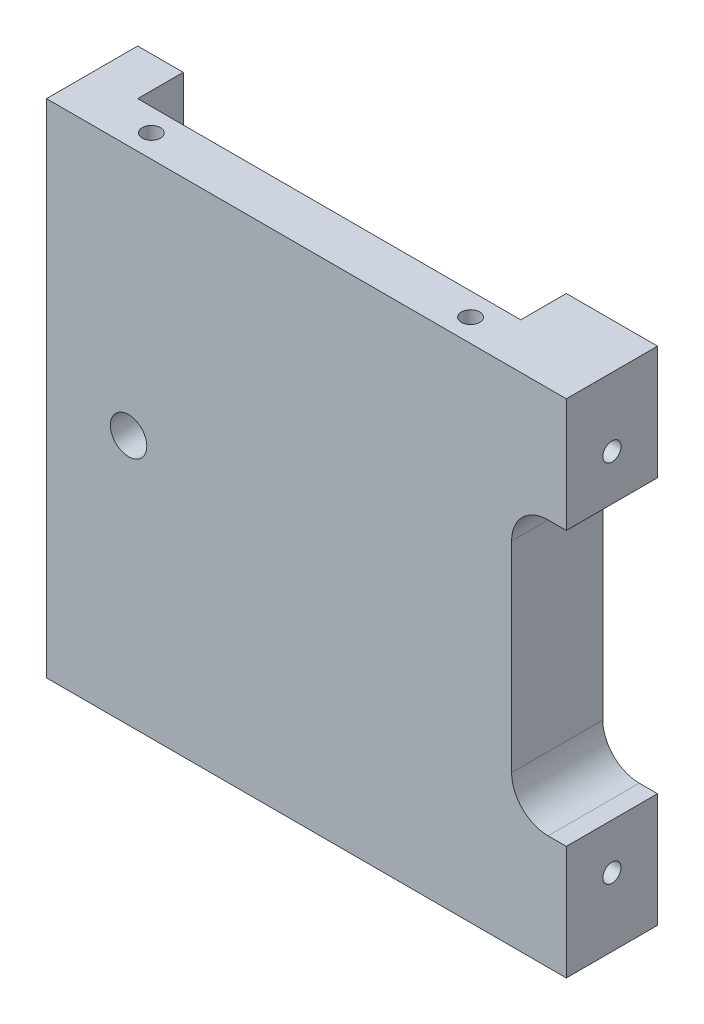
ISO-10303-21;
HEADER;
FILE_DESCRIPTION(('STEP AP214'),'2;1');
FILE_NAME('part.step','',(''),(''),'','','');
FILE_SCHEMA(('AUTOMOTIVE_DESIGN { 1 0 10303 214 1 1 1 1 }'));
ENDSEC;
DATA;
#1=APPLICATION_CONTEXT('core data for automotive mechanical design processes');
#2=APPLICATION_PROTOCOL_DEFINITION('international standard','automotive_design',2000,#1);
#3=PRODUCT_CONTEXT('',#1,'mechanical');
#4=PRODUCT('Part','Part','',(#3));
#5=PRODUCT_RELATED_PRODUCT_CATEGORY('part','',(#4));
#6=PRODUCT_DEFINITION_FORMATION('','',#4);
#7=PRODUCT_DEFINITION_CONTEXT('part definition',#1,'design');
#8=PRODUCT_DEFINITION('design','',#6,#7);
#9=PRODUCT_DEFINITION_SHAPE('','',#8);
#10=(LENGTH_UNIT() NAMED_UNIT(*) SI_UNIT(.MILLI.,.METRE.));
#11=(NAMED_UNIT(*) PLANE_ANGLE_UNIT() SI_UNIT($,.RADIAN.));
#12=(NAMED_UNIT(*) SI_UNIT($,.STERADIAN.) SOLID_ANGLE_UNIT());
#13=UNCERTAINTY_MEASURE_WITH_UNIT(LENGTH_MEASURE(1.E-05),#10,'distance_accuracy_value','');
#14=(GEOMETRIC_REPRESENTATION_CONTEXT(3) GLOBAL_UNCERTAINTY_ASSIGNED_CONTEXT((#13)) GLOBAL_UNIT_ASSIGNED_CONTEXT((#10,
#11,#12)) REPRESENTATION_CONTEXT('',''));
#15=CARTESIAN_POINT('',(0.,0.,0.));
#16=DIRECTION('',(0.,0.,1.));
#17=DIRECTION('',(1.,0.,0.));
#18=AXIS2_PLACEMENT_3D('',#15,#16,#17);
#19=CARTESIAN_POINT('',(85.,-27.5,10.));
#20=DIRECTION('',(-1.,0.,0.));
#21=DIRECTION('',(0.,0.,1.));
#22=AXIS2_PLACEMENT_3D('',#19,#20,#21);
#23=PLANE('',#22);
#24=CARTESIAN_POINT('',(85.,-20.,5.));
#25=DIRECTION('',(1.,0.,0.));
#26=DIRECTION('',(0.,0.,-1.));
#27=AXIS2_PLACEMENT_3D('',#24,#25,#26);
#28=CIRCLE('',#27,0.999999999999997);
#29=CARTESIAN_POINT('',(85.,-20.,4.));
#30=VERTEX_POINT('',#29);
#31=EDGE_CURVE('E305',#30,#30,#28,.T.);
#32=ORIENTED_EDGE('',*,*,#31,.F.);
#33=EDGE_LOOP('',(#32));
#34=FACE_BOUND('',#33,.T.);
#35=DIRECTION('',(0.,1.,0.));
#36=VECTOR('',#35,1.);
#37=CARTESIAN_POINT('',(85.,-27.5,0.));
#38=LINE('',#37,#36);
#39=CARTESIAN_POINT('',(85.,-27.5,0.));
#40=VERTEX_POINT('',#39);
#41=CARTESIAN_POINT('',(85.,-15.,0.));
#42=VERTEX_POINT('',#41);
#43=EDGE_CURVE('E205',#40,#42,#38,.T.);
#44=ORIENTED_EDGE('',*,*,#43,.T.);
#45=DIRECTION('',(0.,0.,1.));
#46=VECTOR('',#45,1.);
#47=CARTESIAN_POINT('',(85.,-15.,0.));
#48=LINE('',#47,#46);
#49=CARTESIAN_POINT('',(85.,-15.,10.));
#50=VERTEX_POINT('',#49);
#51=EDGE_CURVE('E197',#42,#50,#48,.T.);
#52=ORIENTED_EDGE('',*,*,#51,.T.);
#53=DIRECTION('',(0.,1.,0.));
#54=VECTOR('',#53,1.);
#55=CARTESIAN_POINT('',(85.,-27.5,10.));
#56=LINE('',#55,#54);
#57=CARTESIAN_POINT('',(85.,-27.5,10.));
#58=VERTEX_POINT('',#57);
#59=EDGE_CURVE('E368',#58,#50,#56,.T.);
#60=ORIENTED_EDGE('',*,*,#59,.F.);
#61=DIRECTION('',(0.,0.,-1.));
#62=VECTOR('',#61,1.);
#63=CARTESIAN_POINT('',(85.,-27.5,10.));
#64=LINE('',#63,#62);
#65=EDGE_CURVE('E218',#58,#40,#64,.T.);
#66=ORIENTED_EDGE('',*,*,#65,.T.);
#67=EDGE_LOOP('',(#44,#52,#60,#66));
#68=FACE_BOUND('',#67,.T.);
#69=ADVANCED_FACE('F36',(#34,#68),#23,.F.);
#70=CARTESIAN_POINT('',(0.,27.5,10.));
#71=DIRECTION('',(0.,-1.,0.));
#72=DIRECTION('',(0.,0.,-1.));
#73=AXIS2_PLACEMENT_3D('',#70,#71,#72);
#74=PLANE('',#73);
#75=DIRECTION('',(-1.,0.,0.));
#76=VECTOR('',#75,1.);
#77=CARTESIAN_POINT('',(0.,27.5,0.));
#78=LINE('',#77,#76);
#79=CARTESIAN_POINT('',(33.,27.5,0.));
#80=VERTEX_POINT('',#79);
#81=CARTESIAN_POINT('',(28.,27.5,0.));
#82=VERTEX_POINT('',#81);
#83=EDGE_CURVE('E209',#80,#82,#78,.T.);
#84=ORIENTED_EDGE('',*,*,#83,.T.);
#85=DIRECTION('',(0.,0.,1.));
#86=VECTOR('',#85,1.);
#87=CARTESIAN_POINT('',(28.,27.5,10.));
#88=LINE('',#87,#86);
#89=CARTESIAN_POINT('',(28.,27.5,10.));
#90=VERTEX_POINT('',#89);
#91=EDGE_CURVE('E287',#82,#90,#88,.T.);
#92=ORIENTED_EDGE('',*,*,#91,.T.);
#93=DIRECTION('',(-1.,0.,0.));
#94=VECTOR('',#93,1.);
#95=CARTESIAN_POINT('',(0.,27.5,10.));
#96=LINE('',#95,#94);
#97=CARTESIAN_POINT('',(85.,27.5,10.));
#98=VERTEX_POINT('',#97);
#99=EDGE_CURVE('E219',#98,#90,#96,.T.);
#100=ORIENTED_EDGE('',*,*,#99,.F.);
#101=DIRECTION('',(0.,0.,-1.));
#102=VECTOR('',#101,1.);
#103=CARTESIAN_POINT('',(85.,27.5,10.));
#104=LINE('',#103,#102);
#105=CARTESIAN_POINT('',(85.,27.5,0.));
#106=VERTEX_POINT('',#105);
#107=EDGE_CURVE('E216',#98,#106,#104,.T.);
#108=ORIENTED_EDGE('',*,*,#107,.T.);
#109=CARTESIAN_POINT('',(75.,27.5,0.));
#110=VERTEX_POINT('',#109);
#111=EDGE_CURVE('E204',#106,#110,#78,.T.);
#112=ORIENTED_EDGE('',*,*,#111,.T.);
#113=DIRECTION('',(0.,0.,-1.));
#114=VECTOR('',#113,1.);
#115=CARTESIAN_POINT('',(75.,27.5,0.));
#116=LINE('',#115,#114);
#117=CARTESIAN_POINT('',(75.,27.5,5.));
#118=VERTEX_POINT('',#117);
#119=EDGE_CURVE('E344',#118,#110,#116,.T.);
#120=ORIENTED_EDGE('',*,*,#119,.F.);
#121=DIRECTION('',(1.,0.,0.));
#122=VECTOR('',#121,1.);
#123=CARTESIAN_POINT('',(33.,27.5,5.));
#124=LINE('',#123,#122);
#125=CARTESIAN_POINT('',(33.,27.5,5.));
#126=VERTEX_POINT('',#125);
#127=EDGE_CURVE('E353',#126,#118,#124,.T.);
#128=ORIENTED_EDGE('',*,*,#127,.F.);
#129=DIRECTION('',(0.,0.,1.));
#130=VECTOR('',#129,1.);
#131=CARTESIAN_POINT('',(33.,27.5,0.));
#132=LINE('',#131,#130);
#133=EDGE_CURVE('E226',#80,#126,#132,.T.);
#134=ORIENTED_EDGE('',*,*,#133,.F.);
#135=EDGE_LOOP('',(#84,#92,#100,#108,#112,#120,#128,#134));
#136=FACE_BOUND('',#135,.T.);
#137=CARTESIAN_POINT('',(72.,27.5,7.50000000000001));
#138=DIRECTION('',(0.,1.,0.));
#139=DIRECTION('',(0.,0.,1.));
#140=AXIS2_PLACEMENT_3D('',#137,#138,#139);
#141=CIRCLE('',#140,1.);
#142=CARTESIAN_POINT('',(72.,27.5,8.50000000000001));
#143=VERTEX_POINT('',#142);
#144=EDGE_CURVE('E320',#143,#143,#141,.T.);
#145=ORIENTED_EDGE('',*,*,#144,.F.);
#146=EDGE_LOOP('',(#145));
#147=FACE_BOUND('',#146,.T.);
#148=CARTESIAN_POINT('',(37.,27.5,7.5));
#149=DIRECTION('',(0.,1.,0.));
#150=DIRECTION('',(0.,0.,1.));
#151=AXIS2_PLACEMENT_3D('',#148,#149,#150);
#152=CIRCLE('',#151,1.);
#153=CARTESIAN_POINT('',(37.,27.5,8.5));
#154=VERTEX_POINT('',#153);
#155=EDGE_CURVE('E314',#154,#154,#152,.T.);
#156=ORIENTED_EDGE('',*,*,#155,.F.);
#157=EDGE_LOOP('',(#156));
#158=FACE_BOUND('',#157,.T.);
#159=ADVANCED_FACE('F374',(#136,#147,#158),#74,.F.);
#160=CARTESIAN_POINT('',(0.,0.,0.));
#161=DIRECTION('',(0.,0.,-1.));
#162=DIRECTION('',(-1.,0.,0.));
#163=AXIS2_PLACEMENT_3D('',#160,#161,#162);
#164=PLANE('',#163);
#165=DIRECTION('',(0.,-1.,0.));
#166=VECTOR('',#165,1.);
#167=CARTESIAN_POINT('',(28.,27.5,0.));
#168=LINE('',#167,#166);
#169=CARTESIAN_POINT('',(28.,-27.5,0.));
#170=VERTEX_POINT('',#169);
#171=EDGE_CURVE('E290',#82,#170,#168,.T.);
#172=ORIENTED_EDGE('',*,*,#171,.F.);
#173=ORIENTED_EDGE('',*,*,#83,.F.);
#174=DIRECTION('',(0.,1.,0.));
#175=VECTOR('',#174,1.);
#176=CARTESIAN_POINT('',(33.,-27.5,0.));
#177=LINE('',#176,#175);
#178=CARTESIAN_POINT('',(33.,-27.5,0.));
#179=VERTEX_POINT('',#178);
#180=EDGE_CURVE('E357',#179,#80,#177,.T.);
#181=ORIENTED_EDGE('',*,*,#180,.F.);
#182=DIRECTION('',(1.,0.,0.));
#183=VECTOR('',#182,1.);
#184=CARTESIAN_POINT('',(0.,-27.5,0.));
#185=LINE('',#184,#183);
#186=EDGE_CURVE('E206',#170,#179,#185,.T.);
#187=ORIENTED_EDGE('',*,*,#186,.F.);
#188=EDGE_LOOP('',(#172,#173,#181,#187));
#189=FACE_BOUND('',#188,.T.);
#190=ADVANCED_FACE('F384',(#189),#164,.T.);
#191=CARTESIAN_POINT('',(0.,-27.5,10.));
#192=DIRECTION('',(0.,1.,0.));
#193=DIRECTION('',(0.,0.,1.));
#194=AXIS2_PLACEMENT_3D('',#191,#192,#193);
#195=PLANE('',#194);
#196=CARTESIAN_POINT('',(37.,-27.5,7.5));
#197=DIRECTION('',(0.,-1.,0.));
#198=DIRECTION('',(0.,0.,-1.));
#199=AXIS2_PLACEMENT_3D('',#196,#197,#198);
#200=CIRCLE('',#199,1.);
#201=CARTESIAN_POINT('',(37.,-27.5,6.5));
#202=VERTEX_POINT('',#201);
#203=EDGE_CURVE('E326',#202,#202,#200,.T.);
#204=ORIENTED_EDGE('',*,*,#203,.F.);
#205=EDGE_LOOP('',(#204));
#206=FACE_BOUND('',#205,.T.);
#207=CARTESIAN_POINT('',(72.,-27.5,7.50000000000001));
#208=DIRECTION('',(0.,-1.,0.));
#209=DIRECTION('',(0.,0.,-1.));
#210=AXIS2_PLACEMENT_3D('',#207,#208,#209);
#211=CIRCLE('',#210,1.);
#212=CARTESIAN_POINT('',(72.,-27.5,6.50000000000001));
#213=VERTEX_POINT('',#212);
#214=EDGE_CURVE('E332',#213,#213,#211,.T.);
#215=ORIENTED_EDGE('',*,*,#214,.F.);
#216=EDGE_LOOP('',(#215));
#217=FACE_BOUND('',#216,.T.);
#218=DIRECTION('',(1.,0.,0.));
#219=VECTOR('',#218,1.);
#220=CARTESIAN_POINT('',(0.,-27.5,10.));
#221=LINE('',#220,#219);
#222=CARTESIAN_POINT('',(28.,-27.5,10.));
#223=VERTEX_POINT('',#222);
#224=EDGE_CURVE('E215',#223,#58,#221,.T.);
#225=ORIENTED_EDGE('',*,*,#224,.F.);
#226=DIRECTION('',(0.,0.,1.));
#227=VECTOR('',#226,1.);
#228=CARTESIAN_POINT('',(28.,-27.5,10.));
#229=LINE('',#228,#227);
#230=EDGE_CURVE('E285',#170,#223,#229,.T.);
#231=ORIENTED_EDGE('',*,*,#230,.F.);
#232=ORIENTED_EDGE('',*,*,#186,.T.);
#233=DIRECTION('',(0.,0.,1.));
#234=VECTOR('',#233,1.);
#235=CARTESIAN_POINT('',(33.,-27.5,0.));
#236=LINE('',#235,#234);
#237=CARTESIAN_POINT('',(33.,-27.5,5.));
#238=VERTEX_POINT('',#237);
#239=EDGE_CURVE('E340',#179,#238,#236,.T.);
#240=ORIENTED_EDGE('',*,*,#239,.T.);
#241=DIRECTION('',(1.,0.,0.));
#242=VECTOR('',#241,1.);
#243=CARTESIAN_POINT('',(33.,-27.5,5.));
#244=LINE('',#243,#242);
#245=CARTESIAN_POINT('',(75.,-27.5,5.));
#246=VERTEX_POINT('',#245);
#247=EDGE_CURVE('E343',#238,#246,#244,.T.);
#248=ORIENTED_EDGE('',*,*,#247,.T.);
#249=DIRECTION('',(0.,0.,-1.));
#250=VECTOR('',#249,1.);
#251=CARTESIAN_POINT('',(75.,-27.5,0.));
#252=LINE('',#251,#250);
#253=CARTESIAN_POINT('',(75.,-27.5,0.));
#254=VERTEX_POINT('',#253);
#255=EDGE_CURVE('E347',#246,#254,#252,.T.);
#256=ORIENTED_EDGE('',*,*,#255,.T.);
#257=EDGE_CURVE('E210',#254,#40,#185,.T.);
#258=ORIENTED_EDGE('',*,*,#257,.T.);
#259=ORIENTED_EDGE('',*,*,#65,.F.);
#260=EDGE_LOOP('',(#225,#231,#232,#240,#248,#256,#258,#259));
#261=FACE_BOUND('',#260,.T.);
#262=ADVANCED_FACE('F388',(#206,#217,#261),#195,.F.);
#263=CARTESIAN_POINT('',(85.,20.,5.00000000000001));
#264=DIRECTION('',(1.,0.,0.));
#265=DIRECTION('',(0.,0.,-1.));
#266=AXIS2_PLACEMENT_3D('',#263,#264,#265);
#267=CIRCLE('',#266,0.999999999999997);
#268=CARTESIAN_POINT('',(85.,20.,4.00000000000001));
#269=VERTEX_POINT('',#268);
#270=EDGE_CURVE('E295',#269,#269,#267,.T.);
#271=ORIENTED_EDGE('',*,*,#270,.F.);
#272=EDGE_LOOP('',(#271));
#273=FACE_BOUND('',#272,.T.);
#274=CARTESIAN_POINT('',(85.,15.,10.));
#275=VERTEX_POINT('',#274);
#276=EDGE_CURVE('E196',#275,#98,#56,.T.);
#277=ORIENTED_EDGE('',*,*,#276,.F.);
#278=DIRECTION('',(0.,0.,1.));
#279=VECTOR('',#278,1.);
#280=CARTESIAN_POINT('',(85.,15.,0.));
#281=LINE('',#280,#279);
#282=CARTESIAN_POINT('',(85.,15.,0.));
#283=VERTEX_POINT('',#282);
#284=EDGE_CURVE('E181',#283,#275,#281,.T.);
#285=ORIENTED_EDGE('',*,*,#284,.F.);
#286=EDGE_CURVE('E194',#283,#106,#38,.T.);
#287=ORIENTED_EDGE('',*,*,#286,.T.);
#288=ORIENTED_EDGE('',*,*,#107,.F.);
#289=EDGE_LOOP('',(#277,#285,#287,#288));
#290=FACE_BOUND('',#289,.T.);
#291=ADVANCED_FACE('F192',(#273,#290),#23,.F.);
#292=CARTESIAN_POINT('',(0.,0.,10.));
#293=DIRECTION('',(0.,0.,-1.));
#294=DIRECTION('',(-1.,0.,0.));
#295=AXIS2_PLACEMENT_3D('',#292,#293,#294);
#296=PLANE('',#295);
#297=CARTESIAN_POINT('',(37.,0.,10.));
#298=DIRECTION('',(0.,0.,1.));
#299=DIRECTION('',(1.,0.,0.));
#300=AXIS2_PLACEMENT_3D('',#297,#298,#299);
#301=CIRCLE('',#300,2.);
#302=CARTESIAN_POINT('',(39.,0.,10.));
#303=VERTEX_POINT('',#302);
#304=EDGE_CURVE('E227',#303,#303,#301,.T.);
#305=ORIENTED_EDGE('',*,*,#304,.F.);
#306=EDGE_LOOP('',(#305));
#307=FACE_BOUND('',#306,.T.);
#308=ORIENTED_EDGE('',*,*,#59,.T.);
#309=DIRECTION('',(1.,0.,0.));
#310=VECTOR('',#309,1.);
#311=CARTESIAN_POINT('',(85.,-15.,10.));
#312=LINE('',#311,#310);
#313=CARTESIAN_POINT('',(83.,-15.,10.));
#314=VERTEX_POINT('',#313);
#315=EDGE_CURVE('E188',#314,#50,#312,.T.);
#316=ORIENTED_EDGE('',*,*,#315,.F.);
#317=CARTESIAN_POINT('',(83.,-11.,10.));
#318=DIRECTION('',(0.,0.,-1.));
#319=DIRECTION('',(-1.,0.,0.));
#320=AXIS2_PLACEMENT_3D('',#317,#318,#319);
#321=CIRCLE('',#320,4.);
#322=CARTESIAN_POINT('',(79.,-11.,10.));
#323=VERTEX_POINT('',#322);
#324=EDGE_CURVE('E44',#314,#323,#321,.T.);
#325=ORIENTED_EDGE('',*,*,#324,.T.);
#326=DIRECTION('',(0.,-1.,0.));
#327=VECTOR('',#326,1.);
#328=CARTESIAN_POINT('',(79.,-15.,10.));
#329=LINE('',#328,#327);
#330=CARTESIAN_POINT('',(79.,11.,10.));
#331=VERTEX_POINT('',#330);
#332=EDGE_CURVE('E268',#331,#323,#329,.T.);
#333=ORIENTED_EDGE('',*,*,#332,.F.);
#334=CARTESIAN_POINT('',(83.,11.,10.));
#335=DIRECTION('',(0.,0.,-1.));
#336=DIRECTION('',(-1.,0.,0.));
#337=AXIS2_PLACEMENT_3D('',#334,#335,#336);
#338=CIRCLE('',#337,4.);
#339=CARTESIAN_POINT('',(83.,15.,10.));
#340=VERTEX_POINT('',#339);
#341=EDGE_CURVE('E259',#331,#340,#338,.T.);
#342=ORIENTED_EDGE('',*,*,#341,.T.);
#343=DIRECTION('',(-1.,0.,0.));
#344=VECTOR('',#343,1.);
#345=CARTESIAN_POINT('',(85.,15.,10.));
#346=LINE('',#345,#344);
#347=EDGE_CURVE('E273',#275,#340,#346,.T.);
#348=ORIENTED_EDGE('',*,*,#347,.F.);
#349=ORIENTED_EDGE('',*,*,#276,.T.);
#350=ORIENTED_EDGE('',*,*,#99,.T.);
#351=DIRECTION('',(0.,-1.,0.));
#352=VECTOR('',#351,1.);
#353=CARTESIAN_POINT('',(28.,27.5,10.));
#354=LINE('',#353,#352);
#355=EDGE_CURVE('E292',#90,#223,#354,.T.);
#356=ORIENTED_EDGE('',*,*,#355,.T.);
#357=ORIENTED_EDGE('',*,*,#224,.T.);
#358=EDGE_LOOP('',(#308,#316,#325,#333,#342,#348,#349,#350,#356,#357));
#359=FACE_BOUND('',#358,.T.);
#360=ADVANCED_FACE('F267',(#307,#359),#296,.F.);
#361=DIRECTION('',(0.,-1.,0.));
#362=VECTOR('',#361,1.);
#363=CARTESIAN_POINT('',(79.,-15.,0.));
#364=LINE('',#363,#362);
#365=CARTESIAN_POINT('',(79.,11.,0.));
#366=VERTEX_POINT('',#365);
#367=CARTESIAN_POINT('',(79.,-11.,0.));
#368=VERTEX_POINT('',#367);
#369=EDGE_CURVE('E187',#366,#368,#364,.T.);
#370=ORIENTED_EDGE('',*,*,#369,.T.);
#371=CARTESIAN_POINT('',(83.,-11.,0.));
#372=DIRECTION('',(0.,0.,-1.));
#373=DIRECTION('',(-1.,0.,0.));
#374=AXIS2_PLACEMENT_3D('',#371,#372,#373);
#375=CIRCLE('',#374,4.);
#376=CARTESIAN_POINT('',(83.,-15.,0.));
#377=VERTEX_POINT('',#376);
#378=EDGE_CURVE('E11',#368,#377,#375,.F.);
#379=ORIENTED_EDGE('',*,*,#378,.T.);
#380=DIRECTION('',(1.,0.,0.));
#381=VECTOR('',#380,1.);
#382=CARTESIAN_POINT('',(85.,-15.,0.));
#383=LINE('',#382,#381);
#384=EDGE_CURVE('E198',#377,#42,#383,.T.);
#385=ORIENTED_EDGE('',*,*,#384,.T.);
#386=ORIENTED_EDGE('',*,*,#43,.F.);
#387=ORIENTED_EDGE('',*,*,#257,.F.);
#388=DIRECTION('',(0.,1.,0.));
#389=VECTOR('',#388,1.);
#390=CARTESIAN_POINT('',(75.,-27.5,0.));
#391=LINE('',#390,#389);
#392=EDGE_CURVE('E359',#254,#110,#391,.T.);
#393=ORIENTED_EDGE('',*,*,#392,.T.);
#394=ORIENTED_EDGE('',*,*,#111,.F.);
#395=ORIENTED_EDGE('',*,*,#286,.F.);
#396=DIRECTION('',(-1.,0.,0.));
#397=VECTOR('',#396,1.);
#398=CARTESIAN_POINT('',(85.,15.,0.));
#399=LINE('',#398,#397);
#400=CARTESIAN_POINT('',(83.,15.,0.));
#401=VERTEX_POINT('',#400);
#402=EDGE_CURVE('E177',#283,#401,#399,.T.);
#403=ORIENTED_EDGE('',*,*,#402,.T.);
#404=CARTESIAN_POINT('',(83.,11.,0.));
#405=DIRECTION('',(0.,0.,-1.));
#406=DIRECTION('',(-1.,0.,0.));
#407=AXIS2_PLACEMENT_3D('',#404,#405,#406);
#408=CIRCLE('',#407,4.);
#409=EDGE_CURVE('E261',#401,#366,#408,.F.);
#410=ORIENTED_EDGE('',*,*,#409,.T.);
#411=EDGE_LOOP('',(#370,#379,#385,#386,#387,#393,#394,#395,#403,#410));
#412=FACE_BOUND('',#411,.T.);
#413=ADVANCED_FACE('F201',(#412),#164,.T.);
#414=CARTESIAN_POINT('',(33.,-27.5,0.));
#415=DIRECTION('',(-1.,0.,0.));
#416=DIRECTION('',(0.,0.,1.));
#417=AXIS2_PLACEMENT_3D('',#414,#415,#416);
#418=PLANE('',#417);
#419=ORIENTED_EDGE('',*,*,#133,.T.);
#420=DIRECTION('',(0.,1.,0.));
#421=VECTOR('',#420,1.);
#422=CARTESIAN_POINT('',(33.,-27.5,5.));
#423=LINE('',#422,#421);
#424=EDGE_CURVE('E350',#238,#126,#423,.T.);
#425=ORIENTED_EDGE('',*,*,#424,.F.);
#426=ORIENTED_EDGE('',*,*,#239,.F.);
#427=ORIENTED_EDGE('',*,*,#180,.T.);
#428=EDGE_LOOP('',(#419,#425,#426,#427));
#429=FACE_BOUND('',#428,.T.);
#430=ADVANCED_FACE('F390',(#429),#418,.F.);
#431=CARTESIAN_POINT('',(75.,-27.5,0.));
#432=DIRECTION('',(1.,0.,0.));
#433=DIRECTION('',(0.,0.,-1.));
#434=AXIS2_PLACEMENT_3D('',#431,#432,#433);
#435=PLANE('',#434);
#436=DIRECTION('',(0.,1.,0.));
#437=VECTOR('',#436,1.);
#438=CARTESIAN_POINT('',(75.,-27.5,5.));
#439=LINE('',#438,#437);
#440=CARTESIAN_POINT('',(75.,-19.,5.));
#441=VERTEX_POINT('',#440);
#442=CARTESIAN_POINT('',(75.,19.,5.));
#443=VERTEX_POINT('',#442);
#444=EDGE_CURVE('E364',#441,#443,#439,.T.);
#445=ORIENTED_EDGE('',*,*,#444,.T.);
#446=CARTESIAN_POINT('',(75.,20.,5.00000000000001));
#447=DIRECTION('',(1.,0.,0.));
#448=DIRECTION('',(0.,0.,-1.));
#449=AXIS2_PLACEMENT_3D('',#446,#447,#448);
#450=CIRCLE('',#449,0.999999999999997);
#451=CARTESIAN_POINT('',(75.,21.,5.));
#452=VERTEX_POINT('',#451);
#453=EDGE_CURVE('E302',#443,#452,#450,.T.);
#454=ORIENTED_EDGE('',*,*,#453,.T.);
#455=EDGE_CURVE('E365',#452,#118,#439,.T.);
#456=ORIENTED_EDGE('',*,*,#455,.T.);
#457=ORIENTED_EDGE('',*,*,#119,.T.);
#458=ORIENTED_EDGE('',*,*,#392,.F.);
#459=ORIENTED_EDGE('',*,*,#255,.F.);
#460=CARTESIAN_POINT('',(75.,-21.,5.));
#461=VERTEX_POINT('',#460);
#462=EDGE_CURVE('E361',#246,#461,#439,.T.);
#463=ORIENTED_EDGE('',*,*,#462,.T.);
#464=CARTESIAN_POINT('',(75.,-20.,5.));
#465=DIRECTION('',(1.,0.,0.));
#466=DIRECTION('',(0.,0.,-1.));
#467=AXIS2_PLACEMENT_3D('',#464,#465,#466);
#468=CIRCLE('',#467,0.999999999999997);
#469=EDGE_CURVE('E311',#461,#441,#468,.T.);
#470=ORIENTED_EDGE('',*,*,#469,.T.);
#471=EDGE_LOOP('',(#445,#454,#456,#457,#458,#459,#463,#470));
#472=FACE_BOUND('',#471,.T.);
#473=ADVANCED_FACE('F433',(#472),#435,.F.);
#474=CARTESIAN_POINT('',(33.,-27.5,5.));
#475=DIRECTION('',(0.,0.,1.));
#476=DIRECTION('',(1.,0.,0.));
#477=AXIS2_PLACEMENT_3D('',#474,#475,#476);
#478=PLANE('',#477);
#479=CARTESIAN_POINT('',(37.,0.,5.));
#480=DIRECTION('',(0.,0.,1.));
#481=DIRECTION('',(1.,0.,0.));
#482=AXIS2_PLACEMENT_3D('',#479,#480,#481);
#483=CIRCLE('',#482,2.);
#484=CARTESIAN_POINT('',(39.,0.,5.));
#485=VERTEX_POINT('',#484);
#486=EDGE_CURVE('E223',#485,#485,#483,.T.);
#487=ORIENTED_EDGE('',*,*,#486,.T.);
#488=EDGE_LOOP('',(#487));
#489=FACE_BOUND('',#488,.T.);
#490=DIRECTION('',(0.515038074910056,-0.857167300702111,0.));
#491=VECTOR('',#490,1.);
#492=CARTESIAN_POINT('',(72.3991393809724,20.,5.));
#493=LINE('',#492,#491);
#494=CARTESIAN_POINT('',(72.3991393809724,20.,5.));
#495=VERTEX_POINT('',#494);
#496=CARTESIAN_POINT('',(73.,19.,5.));
#497=VERTEX_POINT('',#496);
#498=EDGE_CURVE('E242',#495,#497,#493,.T.);
#499=ORIENTED_EDGE('',*,*,#498,.T.);
#500=DIRECTION('',(1.,0.,0.));
#501=VECTOR('',#500,1.);
#502=CARTESIAN_POINT('',(85.,19.,5.));
#503=LINE('',#502,#501);
#504=EDGE_CURVE('E248',#497,#443,#503,.T.);
#505=ORIENTED_EDGE('',*,*,#504,.T.);
#506=ORIENTED_EDGE('',*,*,#444,.F.);
#507=DIRECTION('',(1.,0.,0.));
#508=VECTOR('',#507,1.);
#509=CARTESIAN_POINT('',(85.,-19.,5.));
#510=LINE('',#509,#508);
#511=CARTESIAN_POINT('',(73.,-19.,5.));
#512=VERTEX_POINT('',#511);
#513=EDGE_CURVE('E233',#441,#512,#510,.F.);
#514=ORIENTED_EDGE('',*,*,#513,.T.);
#515=DIRECTION('',(-0.515038074910056,-0.857167300702111,0.));
#516=VECTOR('',#515,1.);
#517=CARTESIAN_POINT('',(72.3991393809724,-20.,5.));
#518=LINE('',#517,#516);
#519=CARTESIAN_POINT('',(72.3991393809724,-20.,5.));
#520=VERTEX_POINT('',#519);
#521=EDGE_CURVE('E222',#512,#520,#518,.T.);
#522=ORIENTED_EDGE('',*,*,#521,.T.);
#523=DIRECTION('',(0.515038074910056,-0.857167300702111,0.));
#524=VECTOR('',#523,1.);
#525=CARTESIAN_POINT('',(72.3991393809724,-20.,5.));
#526=LINE('',#525,#524);
#527=CARTESIAN_POINT('',(73.,-21.,5.));
#528=VERTEX_POINT('',#527);
#529=EDGE_CURVE('E230',#520,#528,#526,.T.);
#530=ORIENTED_EDGE('',*,*,#529,.T.);
#531=DIRECTION('',(1.,0.,0.));
#532=VECTOR('',#531,1.);
#533=CARTESIAN_POINT('',(85.,-21.,5.));
#534=LINE('',#533,#532);
#535=EDGE_CURVE('E236',#528,#461,#534,.T.);
#536=ORIENTED_EDGE('',*,*,#535,.T.);
#537=ORIENTED_EDGE('',*,*,#462,.F.);
#538=ORIENTED_EDGE('',*,*,#247,.F.);
#539=ORIENTED_EDGE('',*,*,#424,.T.);
#540=ORIENTED_EDGE('',*,*,#127,.T.);
#541=ORIENTED_EDGE('',*,*,#455,.F.);
#542=DIRECTION('',(1.,0.,0.));
#543=VECTOR('',#542,1.);
#544=CARTESIAN_POINT('',(85.,21.,5.));
#545=LINE('',#544,#543);
#546=CARTESIAN_POINT('',(73.,21.,5.));
#547=VERTEX_POINT('',#546);
#548=EDGE_CURVE('E245',#452,#547,#545,.F.);
#549=ORIENTED_EDGE('',*,*,#548,.T.);
#550=DIRECTION('',(-0.515038074910056,-0.857167300702111,0.));
#551=VECTOR('',#550,1.);
#552=CARTESIAN_POINT('',(72.3991393809724,20.,5.));
#553=LINE('',#552,#551);
#554=EDGE_CURVE('E239',#547,#495,#553,.T.);
#555=ORIENTED_EDGE('',*,*,#554,.T.);
#556=EDGE_LOOP('',(#499,#505,#506,#514,#522,#530,#536,#537,#538,#539,#540,#541,#549,#555));
#557=FACE_BOUND('',#556,.T.);
#558=ADVANCED_FACE('F394',(#489,#557),#478,.F.);
#559=CARTESIAN_POINT('',(37.,0.,0.));
#560=DIRECTION('',(0.,0.,1.));
#561=DIRECTION('',(1.,0.,0.));
#562=AXIS2_PLACEMENT_3D('',#559,#560,#561);
#563=CYLINDRICAL_SURFACE('',#562,2.);
#564=ORIENTED_EDGE('',*,*,#304,.T.);
#565=EDGE_LOOP('',(#564));
#566=FACE_BOUND('',#565,.T.);
#567=ORIENTED_EDGE('',*,*,#486,.F.);
#568=EDGE_LOOP('',(#567));
#569=FACE_BOUND('',#568,.T.);
#570=ADVANCED_FACE('F479',(#566,#569),#563,.F.);
#571=CARTESIAN_POINT('',(72.,-12.5,7.50000000000001));
#572=DIRECTION('',(0.,-1.,0.));
#573=DIRECTION('',(0.,0.,-1.));
#574=AXIS2_PLACEMENT_3D('',#571,#572,#573);
#575=CONICAL_SURFACE('',#574,1.,1.02974425867665);
#576=CARTESIAN_POINT('',(72.,-11.8991393809724,7.50000000000001));
#577=VERTEX_POINT('',#576);
#578=VERTEX_LOOP('',#577);
#579=FACE_BOUND('',#578,.T.);
#580=CARTESIAN_POINT('',(72.,-12.5,7.50000000000001));
#581=DIRECTION('',(0.,-1.,0.));
#582=DIRECTION('',(0.,0.,-1.));
#583=AXIS2_PLACEMENT_3D('',#580,#581,#582);
#584=CIRCLE('',#583,1.);
#585=CARTESIAN_POINT('',(72.,-12.5,6.50000000000001));
#586=VERTEX_POINT('',#585);
#587=EDGE_CURVE('E335',#586,#586,#584,.T.);
#588=ORIENTED_EDGE('',*,*,#587,.T.);
#589=EDGE_LOOP('',(#588));
#590=FACE_BOUND('',#589,.T.);
#591=ADVANCED_FACE('F475',(#579,#590),#575,.F.);
#592=CARTESIAN_POINT('',(72.,-27.5,7.50000000000001));
#593=DIRECTION('',(0.,-1.,0.));
#594=DIRECTION('',(0.,0.,-1.));
#595=AXIS2_PLACEMENT_3D('',#592,#593,#594);
#596=CYLINDRICAL_SURFACE('',#595,1.);
#597=ORIENTED_EDGE('',*,*,#587,.F.);
#598=EDGE_LOOP('',(#597));
#599=FACE_BOUND('',#598,.T.);
#600=ORIENTED_EDGE('',*,*,#214,.T.);
#601=EDGE_LOOP('',(#600));
#602=FACE_BOUND('',#601,.T.);
#603=ADVANCED_FACE('F471',(#599,#602),#596,.F.);
#604=CARTESIAN_POINT('',(37.,-12.5,7.5));
#605=DIRECTION('',(0.,-1.,0.));
#606=DIRECTION('',(0.,0.,-1.));
#607=AXIS2_PLACEMENT_3D('',#604,#605,#606);
#608=CONICAL_SURFACE('',#607,0.999999999999994,1.02974425867665);
#609=CARTESIAN_POINT('',(37.,-11.8991393809724,7.5));
#610=VERTEX_POINT('',#609);
#611=VERTEX_LOOP('',#610);
#612=FACE_BOUND('',#611,.T.);
#613=CARTESIAN_POINT('',(37.,-12.5,7.5));
#614=DIRECTION('',(0.,-1.,0.));
#615=DIRECTION('',(0.,0.,-1.));
#616=AXIS2_PLACEMENT_3D('',#613,#614,#615);
#617=CIRCLE('',#616,0.999999999999994);
#618=CARTESIAN_POINT('',(37.,-12.5,6.50000000000001));
#619=VERTEX_POINT('',#618);
#620=EDGE_CURVE('E329',#619,#619,#617,.T.);
#621=ORIENTED_EDGE('',*,*,#620,.T.);
#622=EDGE_LOOP('',(#621));
#623=FACE_BOUND('',#622,.T.);
#624=ADVANCED_FACE('F467',(#612,#623),#608,.F.);
#625=CARTESIAN_POINT('',(37.,-27.5,7.5));
#626=DIRECTION('',(0.,-1.,0.));
#627=DIRECTION('',(0.,0.,-1.));
#628=AXIS2_PLACEMENT_3D('',#625,#626,#627);
#629=CYLINDRICAL_SURFACE('',#628,0.999999999999997);
#630=ORIENTED_EDGE('',*,*,#620,.F.);
#631=EDGE_LOOP('',(#630));
#632=FACE_BOUND('',#631,.T.);
#633=ORIENTED_EDGE('',*,*,#203,.T.);
#634=EDGE_LOOP('',(#633));
#635=FACE_BOUND('',#634,.T.);
#636=ADVANCED_FACE('F463',(#632,#635),#629,.F.);
#637=CARTESIAN_POINT('',(72.,12.5,7.50000000000001));
#638=DIRECTION('',(0.,1.,0.));
#639=DIRECTION('',(0.,0.,1.));
#640=AXIS2_PLACEMENT_3D('',#637,#638,#639);
#641=CONICAL_SURFACE('',#640,1.,1.02974425867665);
#642=CARTESIAN_POINT('',(72.,11.8991393809724,7.50000000000001));
#643=VERTEX_POINT('',#642);
#644=VERTEX_LOOP('',#643);
#645=FACE_BOUND('',#644,.T.);
#646=CARTESIAN_POINT('',(72.,12.5,7.50000000000001));
#647=DIRECTION('',(0.,1.,0.));
#648=DIRECTION('',(0.,0.,1.));
#649=AXIS2_PLACEMENT_3D('',#646,#647,#648);
#650=CIRCLE('',#649,1.);
#651=CARTESIAN_POINT('',(72.,12.5,8.50000000000001));
#652=VERTEX_POINT('',#651);
#653=EDGE_CURVE('E323',#652,#652,#650,.T.);
#654=ORIENTED_EDGE('',*,*,#653,.T.);
#655=EDGE_LOOP('',(#654));
#656=FACE_BOUND('',#655,.T.);
#657=ADVANCED_FACE('F459',(#645,#656),#641,.F.);
#658=CARTESIAN_POINT('',(72.,27.5,7.50000000000001));
#659=DIRECTION('',(0.,1.,0.));
#660=DIRECTION('',(0.,0.,1.));
#661=AXIS2_PLACEMENT_3D('',#658,#659,#660);
#662=CYLINDRICAL_SURFACE('',#661,1.);
#663=ORIENTED_EDGE('',*,*,#653,.F.);
#664=EDGE_LOOP('',(#663));
#665=FACE_BOUND('',#664,.T.);
#666=ORIENTED_EDGE('',*,*,#144,.T.);
#667=EDGE_LOOP('',(#666));
#668=FACE_BOUND('',#667,.T.);
#669=ADVANCED_FACE('F455',(#665,#668),#662,.F.);
#670=CARTESIAN_POINT('',(37.,12.5,7.5));
#671=DIRECTION('',(0.,1.,0.));
#672=DIRECTION('',(0.,0.,1.));
#673=AXIS2_PLACEMENT_3D('',#670,#671,#672);
#674=CONICAL_SURFACE('',#673,0.999999999999994,1.02974425867665);
#675=CARTESIAN_POINT('',(37.,11.8991393809724,7.5));
#676=VERTEX_POINT('',#675);
#677=VERTEX_LOOP('',#676);
#678=FACE_BOUND('',#677,.T.);
#679=CARTESIAN_POINT('',(37.,12.5,7.5));
#680=DIRECTION('',(0.,1.,0.));
#681=DIRECTION('',(0.,0.,1.));
#682=AXIS2_PLACEMENT_3D('',#679,#680,#681);
#683=CIRCLE('',#682,0.999999999999994);
#684=CARTESIAN_POINT('',(37.,12.5,8.5));
#685=VERTEX_POINT('',#684);
#686=EDGE_CURVE('E317',#685,#685,#683,.T.);
#687=ORIENTED_EDGE('',*,*,#686,.T.);
#688=EDGE_LOOP('',(#687));
#689=FACE_BOUND('',#688,.T.);
#690=ADVANCED_FACE('F451',(#678,#689),#674,.F.);
#691=CARTESIAN_POINT('',(37.,27.5,7.5));
#692=DIRECTION('',(0.,1.,0.));
#693=DIRECTION('',(0.,0.,1.));
#694=AXIS2_PLACEMENT_3D('',#691,#692,#693);
#695=CYLINDRICAL_SURFACE('',#694,0.999999999999997);
#696=ORIENTED_EDGE('',*,*,#686,.F.);
#697=EDGE_LOOP('',(#696));
#698=FACE_BOUND('',#697,.T.);
#699=ORIENTED_EDGE('',*,*,#155,.T.);
#700=EDGE_LOOP('',(#699));
#701=FACE_BOUND('',#700,.T.);
#702=ADVANCED_FACE('F444',(#698,#701),#695,.F.);
#703=CARTESIAN_POINT('',(85.,-20.,5.));
#704=DIRECTION('',(1.,0.,0.));
#705=DIRECTION('',(0.,0.,-1.));
#706=AXIS2_PLACEMENT_3D('',#703,#704,#705);
#707=CYLINDRICAL_SURFACE('',#706,0.999999999999997);
#708=ORIENTED_EDGE('',*,*,#31,.T.);
#709=EDGE_LOOP('',(#708));
#710=FACE_BOUND('',#709,.T.);
#711=CARTESIAN_POINT('',(73.,-20.,5.));
#712=DIRECTION('',(1.,0.,0.));
#713=DIRECTION('',(0.,0.,-1.));
#714=AXIS2_PLACEMENT_3D('',#711,#712,#713);
#715=CIRCLE('',#714,0.999999999999997);
#716=EDGE_CURVE('E308',#512,#528,#715,.T.);
#717=ORIENTED_EDGE('',*,*,#716,.F.);
#718=ORIENTED_EDGE('',*,*,#513,.F.);
#719=ORIENTED_EDGE('',*,*,#469,.F.);
#720=ORIENTED_EDGE('',*,*,#535,.F.);
#721=EDGE_LOOP('',(#717,#718,#719,#720));
#722=FACE_BOUND('',#721,.T.);
#723=ADVANCED_FACE('F441',(#710,#722),#707,.F.);
#724=CARTESIAN_POINT('',(73.,-20.,5.));
#725=DIRECTION('',(1.,0.,0.));
#726=DIRECTION('',(0.,0.,-1.));
#727=AXIS2_PLACEMENT_3D('',#724,#725,#726);
#728=CONICAL_SURFACE('',#727,0.999999999999997,1.02974425867665);
#729=ORIENTED_EDGE('',*,*,#521,.F.);
#730=ORIENTED_EDGE('',*,*,#716,.T.);
#731=ORIENTED_EDGE('',*,*,#529,.F.);
#732=EDGE_LOOP('',(#729,#730,#731));
#733=FACE_BOUND('',#732,.T.);
#734=ADVANCED_FACE('F425',(#733),#728,.F.);
#735=CARTESIAN_POINT('',(85.,20.,5.00000000000001));
#736=DIRECTION('',(1.,0.,0.));
#737=DIRECTION('',(0.,0.,-1.));
#738=AXIS2_PLACEMENT_3D('',#735,#736,#737);
#739=CYLINDRICAL_SURFACE('',#738,0.999999999999997);
#740=ORIENTED_EDGE('',*,*,#270,.T.);
#741=EDGE_LOOP('',(#740));
#742=FACE_BOUND('',#741,.T.);
#743=CARTESIAN_POINT('',(73.,20.,5.00000000000001));
#744=DIRECTION('',(1.,0.,0.));
#745=DIRECTION('',(0.,0.,-1.));
#746=AXIS2_PLACEMENT_3D('',#743,#744,#745);
#747=CIRCLE('',#746,0.999999999999997);
#748=EDGE_CURVE('E299',#547,#497,#747,.T.);
#749=ORIENTED_EDGE('',*,*,#748,.F.);
#750=ORIENTED_EDGE('',*,*,#548,.F.);
#751=ORIENTED_EDGE('',*,*,#453,.F.);
#752=ORIENTED_EDGE('',*,*,#504,.F.);
#753=EDGE_LOOP('',(#749,#750,#751,#752));
#754=FACE_BOUND('',#753,.T.);
#755=ADVANCED_FACE('F421',(#742,#754),#739,.F.);
#756=CARTESIAN_POINT('',(73.,20.,5.00000000000001));
#757=DIRECTION('',(1.,0.,0.));
#758=DIRECTION('',(0.,0.,-1.));
#759=AXIS2_PLACEMENT_3D('',#756,#757,#758);
#760=CONICAL_SURFACE('',#759,0.999999999999997,1.02974425867665);
#761=ORIENTED_EDGE('',*,*,#554,.F.);
#762=ORIENTED_EDGE('',*,*,#748,.T.);
#763=ORIENTED_EDGE('',*,*,#498,.F.);
#764=EDGE_LOOP('',(#761,#762,#763));
#765=FACE_BOUND('',#764,.T.);
#766=ADVANCED_FACE('F424',(#765),#760,.F.);
#767=CARTESIAN_POINT('',(28.,27.5,10.));
#768=DIRECTION('',(1.,0.,0.));
#769=DIRECTION('',(0.,0.,-1.));
#770=AXIS2_PLACEMENT_3D('',#767,#768,#769);
#771=PLANE('',#770);
#772=ORIENTED_EDGE('',*,*,#230,.T.);
#773=ORIENTED_EDGE('',*,*,#355,.F.);
#774=ORIENTED_EDGE('',*,*,#91,.F.);
#775=ORIENTED_EDGE('',*,*,#171,.T.);
#776=EDGE_LOOP('',(#772,#773,#774,#775));
#777=FACE_BOUND('',#776,.T.);
#778=ADVANCED_FACE('F380',(#777),#771,.F.);
#779=CARTESIAN_POINT('',(85.,-15.,0.));
#780=DIRECTION('',(0.,-1.,0.));
#781=DIRECTION('',(1.,0.,0.));
#782=AXIS2_PLACEMENT_3D('',#779,#780,#781);
#783=PLANE('',#782);
#784=ORIENTED_EDGE('',*,*,#384,.F.);
#785=DIRECTION('',(0.,0.,1.));
#786=VECTOR('',#785,1.);
#787=CARTESIAN_POINT('',(83.,-15.,10.));
#788=LINE('',#787,#786);
#789=EDGE_CURVE('E257',#377,#314,#788,.T.);
#790=ORIENTED_EDGE('',*,*,#789,.T.);
#791=ORIENTED_EDGE('',*,*,#315,.T.);
#792=ORIENTED_EDGE('',*,*,#51,.F.);
#793=EDGE_LOOP('',(#784,#790,#791,#792));
#794=FACE_BOUND('',#793,.T.);
#795=ADVANCED_FACE('F276',(#794),#783,.F.);
#796=CARTESIAN_POINT('',(79.,-15.,0.));
#797=DIRECTION('',(-1.,0.,0.));
#798=DIRECTION('',(0.,0.,1.));
#799=AXIS2_PLACEMENT_3D('',#796,#797,#798);
#800=PLANE('',#799);
#801=ORIENTED_EDGE('',*,*,#369,.F.);
#802=DIRECTION('',(0.,0.,1.));
#803=VECTOR('',#802,1.);
#804=CARTESIAN_POINT('',(79.,11.,10.));
#805=LINE('',#804,#803);
#806=EDGE_CURVE('E253',#366,#331,#805,.T.);
#807=ORIENTED_EDGE('',*,*,#806,.T.);
#808=ORIENTED_EDGE('',*,*,#332,.T.);
#809=DIRECTION('',(0.,0.,1.));
#810=VECTOR('',#809,1.);
#811=CARTESIAN_POINT('',(79.,-11.,0.));
#812=LINE('',#811,#810);
#813=EDGE_CURVE('E251',#323,#368,#812,.F.);
#814=ORIENTED_EDGE('',*,*,#813,.T.);
#815=EDGE_LOOP('',(#801,#807,#808,#814));
#816=FACE_BOUND('',#815,.T.);
#817=ADVANCED_FACE('F271',(#816),#800,.F.);
#818=CARTESIAN_POINT('',(85.,15.,0.));
#819=DIRECTION('',(0.,1.,0.));
#820=DIRECTION('',(-1.,0.,0.));
#821=AXIS2_PLACEMENT_3D('',#818,#819,#820);
#822=PLANE('',#821);
#823=ORIENTED_EDGE('',*,*,#347,.T.);
#824=DIRECTION('',(0.,0.,1.));
#825=VECTOR('',#824,1.);
#826=CARTESIAN_POINT('',(83.,15.,0.));
#827=LINE('',#826,#825);
#828=EDGE_CURVE('E184',#340,#401,#827,.F.);
#829=ORIENTED_EDGE('',*,*,#828,.T.);
#830=ORIENTED_EDGE('',*,*,#402,.F.);
#831=ORIENTED_EDGE('',*,*,#284,.T.);
#832=EDGE_LOOP('',(#823,#829,#830,#831));
#833=FACE_BOUND('',#832,.T.);
#834=ADVANCED_FACE('F180',(#833),#822,.F.);
#835=CARTESIAN_POINT('',(83.,11.,0.));
#836=DIRECTION('',(0.,0.,-1.));
#837=DIRECTION('',(-1.,0.,0.));
#838=AXIS2_PLACEMENT_3D('',#835,#836,#837);
#839=CYLINDRICAL_SURFACE('',#838,4.);
#840=ORIENTED_EDGE('',*,*,#409,.F.);
#841=ORIENTED_EDGE('',*,*,#828,.F.);
#842=ORIENTED_EDGE('',*,*,#341,.F.);
#843=ORIENTED_EDGE('',*,*,#806,.F.);
#844=EDGE_LOOP('',(#840,#841,#842,#843));
#845=FACE_BOUND('',#844,.T.);
#846=ADVANCED_FACE('F553',(#845),#839,.F.);
#847=CARTESIAN_POINT('',(83.,-11.,0.));
#848=DIRECTION('',(0.,0.,-1.));
#849=DIRECTION('',(-1.,0.,0.));
#850=AXIS2_PLACEMENT_3D('',#847,#848,#849);
#851=CYLINDRICAL_SURFACE('',#850,4.);
#852=ORIENTED_EDGE('',*,*,#378,.F.);
#853=ORIENTED_EDGE('',*,*,#813,.F.);
#854=ORIENTED_EDGE('',*,*,#324,.F.);
#855=ORIENTED_EDGE('',*,*,#789,.F.);
#856=EDGE_LOOP('',(#852,#853,#854,#855));
#857=FACE_BOUND('',#856,.T.);
#858=ADVANCED_FACE('F38',(#857),#851,.F.);
#859=CLOSED_SHELL('',(#69,#159,#190,#262,#291,#360,#413,#430,#473,#558,#570,#591,#603,#624,#636,
#657,#669,#690,#702,#723,#734,#755,#766,#778,#795,#817,#834,#846,#858));
#860=MANIFOLD_SOLID_BREP('B2',#859);
#861=ADVANCED_BREP_SHAPE_REPRESENTATION('',(#18,#860),#14);
#862=SHAPE_DEFINITION_REPRESENTATION(#9,#861);
ENDSEC;
END-ISO-10303-21;
